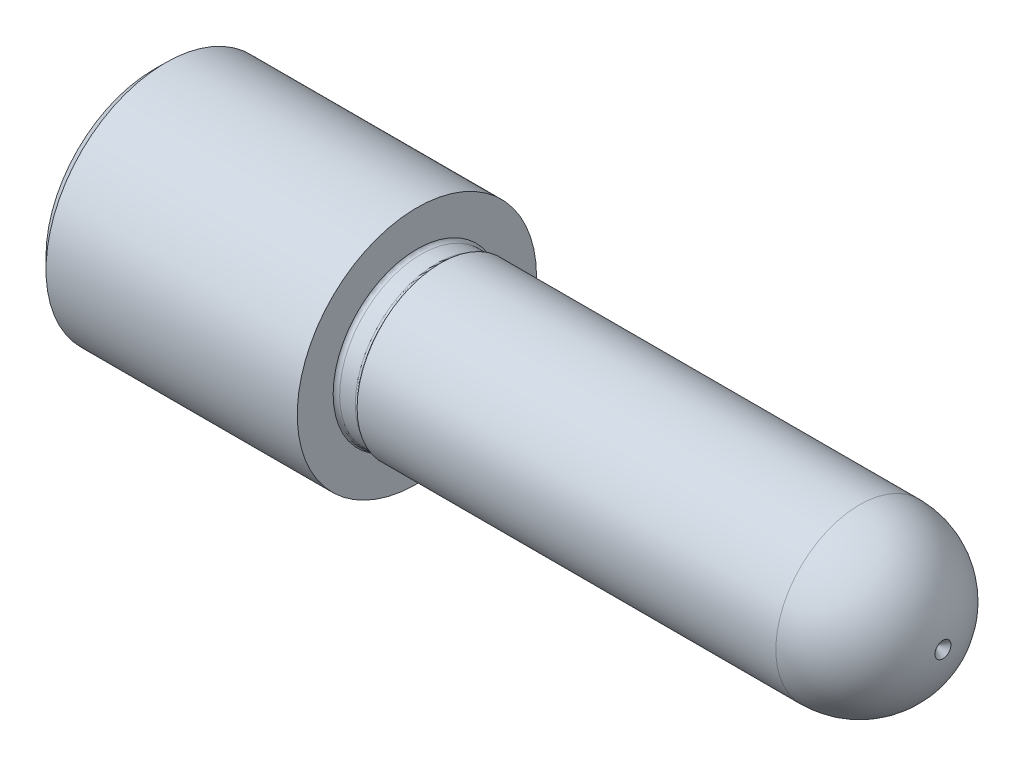
ISO-10303-21;
HEADER;
FILE_DESCRIPTION(('STEP AP214'),'2;1');
FILE_NAME('part.step','',(''),(''),'','','');
FILE_SCHEMA(('AUTOMOTIVE_DESIGN { 1 0 10303 214 1 1 1 1 }'));
ENDSEC;
DATA;
#1=APPLICATION_CONTEXT('core data for automotive mechanical design processes');
#2=APPLICATION_PROTOCOL_DEFINITION('international standard','automotive_design',2000,#1);
#3=PRODUCT_CONTEXT('',#1,'mechanical');
#4=PRODUCT('Part','Part','',(#3));
#5=PRODUCT_RELATED_PRODUCT_CATEGORY('part','',(#4));
#6=PRODUCT_DEFINITION_FORMATION('','',#4);
#7=PRODUCT_DEFINITION_CONTEXT('part definition',#1,'design');
#8=PRODUCT_DEFINITION('design','',#6,#7);
#9=PRODUCT_DEFINITION_SHAPE('','',#8);
#10=(LENGTH_UNIT() NAMED_UNIT(*) SI_UNIT(.MILLI.,.METRE.));
#11=(NAMED_UNIT(*) PLANE_ANGLE_UNIT() SI_UNIT($,.RADIAN.));
#12=(NAMED_UNIT(*) SI_UNIT($,.STERADIAN.) SOLID_ANGLE_UNIT());
#13=UNCERTAINTY_MEASURE_WITH_UNIT(LENGTH_MEASURE(1.E-05),#10,'distance_accuracy_value','');
#14=(GEOMETRIC_REPRESENTATION_CONTEXT(3) GLOBAL_UNCERTAINTY_ASSIGNED_CONTEXT((#13)) GLOBAL_UNIT_ASSIGNED_CONTEXT((#10,
#11,#12)) REPRESENTATION_CONTEXT('',''));
#15=CARTESIAN_POINT('',(0.,0.,0.));
#16=DIRECTION('',(0.,0.,1.));
#17=DIRECTION('',(1.,0.,0.));
#18=AXIS2_PLACEMENT_3D('',#15,#16,#17);
#19=CARTESIAN_POINT('',(2.25869692121705,0.,0.));
#20=DIRECTION('',(-1.,0.,0.));
#21=DIRECTION('',(0.,0.,1.));
#22=AXIS2_PLACEMENT_3D('',#19,#20,#21);
#23=CONICAL_SURFACE('',#22,2.15000000002874,1.04719755120262);
#24=CARTESIAN_POINT('',(3.5000000000025,2.8421709430404E-11,0.));
#25=VERTEX_POINT('',#24);
#26=VERTEX_LOOP('',#25);
#27=FACE_BOUND('',#26,.T.);
#28=CARTESIAN_POINT('',(2.2586969212423,0.,0.));
#29=DIRECTION('',(1.,0.,0.));
#30=DIRECTION('',(0.,0.,-1.));
#31=AXIS2_PLACEMENT_3D('',#28,#29,#30);
#32=CIRCLE('',#31,2.15);
#33=CARTESIAN_POINT('',(2.2586969212423,0.,-2.15));
#34=VERTEX_POINT('',#33);
#35=EDGE_CURVE('E37',#34,#34,#32,.F.);
#36=ORIENTED_EDGE('',*,*,#35,.T.);
#37=EDGE_LOOP('',(#36));
#38=FACE_BOUND('',#37,.T.);
#39=ADVANCED_FACE('F17',(#27,#38),#23,.F.);
#40=CARTESIAN_POINT('',(-4.37065153937885,0.,0.));
#41=DIRECTION('',(1.,0.,0.));
#42=DIRECTION('',(0.,0.,-1.));
#43=AXIS2_PLACEMENT_3D('',#40,#41,#42);
#44=CYLINDRICAL_SURFACE('',#43,2.15);
#45=CARTESIAN_POINT('',(-10.6500000000551,0.,0.));
#46=DIRECTION('',(-1.,0.,0.));
#47=DIRECTION('',(0.,1.,0.));
#48=AXIS2_PLACEMENT_3D('',#45,#46,#47);
#49=CIRCLE('',#48,2.1499999999719);
#50=CARTESIAN_POINT('',(-10.6500000000551,2.1499999999719,0.));
#51=VERTEX_POINT('',#50);
#52=EDGE_CURVE('E39',#51,#51,#49,.T.);
#53=ORIENTED_EDGE('',*,*,#52,.T.);
#54=EDGE_LOOP('',(#53));
#55=FACE_BOUND('',#54,.T.);
#56=ORIENTED_EDGE('',*,*,#35,.F.);
#57=EDGE_LOOP('',(#56));
#58=FACE_BOUND('',#57,.T.);
#59=ADVANCED_FACE('F34',(#55,#58),#44,.F.);
#60=CARTESIAN_POINT('',(-11.0000000000241,0.,0.));
#61=DIRECTION('',(-1.,0.,0.));
#62=DIRECTION('',(0.,0.,1.));
#63=AXIS2_PLACEMENT_3D('',#60,#61,#62);
#64=CONICAL_SURFACE('',#63,2.49999999999773,0.785398163478653);
#65=CARTESIAN_POINT('',(-11.0000000000241,0.,0.));
#66=DIRECTION('',(-1.,0.,0.));
#67=DIRECTION('',(0.,0.,1.));
#68=AXIS2_PLACEMENT_3D('',#65,#66,#67);
#69=CIRCLE('',#68,2.49999999999773);
#70=CARTESIAN_POINT('',(-11.0000000000241,0.,2.49999999999773));
#71=VERTEX_POINT('',#70);
#72=EDGE_CURVE('E20',#71,#71,#69,.F.);
#73=ORIENTED_EDGE('',*,*,#72,.F.);
#74=EDGE_LOOP('',(#73));
#75=FACE_BOUND('',#74,.T.);
#76=ORIENTED_EDGE('',*,*,#52,.F.);
#77=EDGE_LOOP('',(#76));
#78=FACE_BOUND('',#77,.T.);
#79=ADVANCED_FACE('F62',(#75,#78),#64,.F.);
#80=CARTESIAN_POINT('',(-11.,2.5,0.));
#81=DIRECTION('',(-1.,0.,0.));
#82=DIRECTION('',(0.,0.,1.));
#83=AXIS2_PLACEMENT_3D('',#80,#81,#82);
#84=PLANE('',#83);
#85=CARTESIAN_POINT('',(-10.9999999999673,0.,0.));
#86=DIRECTION('',(1.,0.,0.));
#87=DIRECTION('',(0.,0.,-1.));
#88=AXIS2_PLACEMENT_3D('',#85,#86,#87);
#89=CIRCLE('',#88,4.50000000000728);
#90=CARTESIAN_POINT('',(-10.9999999999673,0.,-4.50000000000728));
#91=VERTEX_POINT('',#90);
#92=EDGE_CURVE('E52',#91,#91,#89,.T.);
#93=ORIENTED_EDGE('',*,*,#92,.F.);
#94=EDGE_LOOP('',(#93));
#95=FACE_BOUND('',#94,.T.);
#96=ORIENTED_EDGE('',*,*,#72,.T.);
#97=EDGE_LOOP('',(#96));
#98=FACE_BOUND('',#97,.T.);
#99=ADVANCED_FACE('F60',(#95,#98),#84,.T.);
#100=CARTESIAN_POINT('',(-10.5000000000928,0.,0.));
#101=DIRECTION('',(1.,0.,0.));
#102=DIRECTION('',(0.,0.,-1.));
#103=AXIS2_PLACEMENT_3D('',#100,#101,#102);
#104=CONICAL_SURFACE('',#103,4.99999999993861,0.785398163454292);
#105=ORIENTED_EDGE('',*,*,#92,.T.);
#106=EDGE_LOOP('',(#105));
#107=FACE_BOUND('',#106,.T.);
#108=CARTESIAN_POINT('',(-10.5,0.,0.));
#109=DIRECTION('',(1.,0.,0.));
#110=DIRECTION('',(0.,0.,-1.));
#111=AXIS2_PLACEMENT_3D('',#108,#109,#110);
#112=CIRCLE('',#111,5.);
#113=CARTESIAN_POINT('',(-10.5,0.,-5.));
#114=VERTEX_POINT('',#113);
#115=EDGE_CURVE('E51',#114,#114,#112,.T.);
#116=ORIENTED_EDGE('',*,*,#115,.F.);
#117=EDGE_LOOP('',(#116));
#118=FACE_BOUND('',#117,.T.);
#119=ADVANCED_FACE('F116',(#107,#118),#104,.T.);
#120=CARTESIAN_POINT('',(-5.25,0.,0.));
#121=DIRECTION('',(1.,0.,0.));
#122=DIRECTION('',(0.,0.,-1.));
#123=AXIS2_PLACEMENT_3D('',#120,#121,#122);
#124=CYLINDRICAL_SURFACE('',#123,5.);
#125=ORIENTED_EDGE('',*,*,#115,.T.);
#126=EDGE_LOOP('',(#125));
#127=FACE_BOUND('',#126,.T.);
#128=CARTESIAN_POINT('',(0.,0.,0.));
#129=DIRECTION('',(1.,0.,0.));
#130=DIRECTION('',(0.,0.,-1.));
#131=AXIS2_PLACEMENT_3D('',#128,#129,#130);
#132=CIRCLE('',#131,5.);
#133=CARTESIAN_POINT('',(0.,0.,-5.));
#134=VERTEX_POINT('',#133);
#135=EDGE_CURVE('E49',#134,#134,#132,.T.);
#136=ORIENTED_EDGE('',*,*,#135,.F.);
#137=EDGE_LOOP('',(#136));
#138=FACE_BOUND('',#137,.T.);
#139=ADVANCED_FACE('F112',(#127,#138),#124,.T.);
#140=CARTESIAN_POINT('',(0.,2.5,0.));
#141=DIRECTION('',(1.,0.,0.));
#142=DIRECTION('',(0.,0.,-1.));
#143=AXIS2_PLACEMENT_3D('',#140,#141,#142);
#144=PLANE('',#143);
#145=ORIENTED_EDGE('',*,*,#135,.T.);
#146=EDGE_LOOP('',(#145));
#147=FACE_BOUND('',#146,.T.);
#148=CARTESIAN_POINT('',(0.,0.,0.));
#149=DIRECTION('',(-1.,0.,0.));
#150=DIRECTION('',(0.,0.,1.));
#151=AXIS2_PLACEMENT_3D('',#148,#149,#150);
#152=CIRCLE('',#151,3.5);
#153=CARTESIAN_POINT('',(0.,0.,3.5));
#154=VERTEX_POINT('',#153);
#155=EDGE_CURVE('E45',#154,#154,#152,.T.);
#156=ORIENTED_EDGE('',*,*,#155,.T.);
#157=EDGE_LOOP('',(#156));
#158=FACE_BOUND('',#157,.T.);
#159=ADVANCED_FACE('F108',(#147,#158),#144,.T.);
#160=CARTESIAN_POINT('',(0.173205080756889,0.,0.));
#161=DIRECTION('',(-1.,0.,0.));
#162=DIRECTION('',(0.,0.,1.));
#163=AXIS2_PLACEMENT_3D('',#160,#161,#162);
#164=TOROIDAL_SURFACE('',#163,3.6,0.200000000000001);
#165=CARTESIAN_POINT('',(0.173205080756888,0.,0.));
#166=DIRECTION('',(1.,0.,0.));
#167=DIRECTION('',(0.,0.,-1.));
#168=AXIS2_PLACEMENT_3D('',#165,#166,#167);
#169=CIRCLE('',#168,3.4);
#170=CARTESIAN_POINT('',(0.173205080756888,0.,-3.4));
#171=VERTEX_POINT('',#170);
#172=EDGE_CURVE('E48',#171,#171,#169,.T.);
#173=ORIENTED_EDGE('',*,*,#172,.F.);
#174=EDGE_LOOP('',(#173));
#175=FACE_BOUND('',#174,.T.);
#176=ORIENTED_EDGE('',*,*,#155,.F.);
#177=EDGE_LOOP('',(#176));
#178=FACE_BOUND('',#177,.T.);
#179=ADVANCED_FACE('F103',(#175,#178),#164,.F.);
#180=CARTESIAN_POINT('',(21.9840246199965,0.,0.));
#181=DIRECTION('',(1.,0.,0.));
#182=DIRECTION('',(0.,0.,-1.));
#183=AXIS2_PLACEMENT_3D('',#180,#181,#182);
#184=CONICAL_SURFACE('',#183,0.334024620144646,0.785398163057094);
#185=CARTESIAN_POINT('',(21.6499999998803,-5.6843418860808E-11,0.));
#186=VERTEX_POINT('',#185);
#187=VERTEX_LOOP('',#186);
#188=FACE_BOUND('',#187,.T.);
#189=CARTESIAN_POINT('',(21.9840246200613,0.,0.));
#190=DIRECTION('',(1.,0.,0.));
#191=DIRECTION('',(0.,1.,0.));
#192=AXIS2_PLACEMENT_3D('',#189,#190,#191);
#193=CIRCLE('',#192,0.334024620061248);
#194=CARTESIAN_POINT('',(21.9840246200613,0.334024620061248,0.));
#195=VERTEX_POINT('',#194);
#196=EDGE_CURVE('E94',#195,#195,#193,.F.);
#197=ORIENTED_EDGE('',*,*,#196,.F.);
#198=EDGE_LOOP('',(#197));
#199=FACE_BOUND('',#198,.T.);
#200=ADVANCED_FACE('F107',(#188,#199),#184,.F.);
#201=CARTESIAN_POINT('',(0.5,0.,0.));
#202=DIRECTION('',(1.,0.,0.));
#203=DIRECTION('',(0.,0.,-1.));
#204=AXIS2_PLACEMENT_3D('',#201,#202,#203);
#205=CYLINDRICAL_SURFACE('',#204,3.4);
#206=CARTESIAN_POINT('',(0.826794919243112,0.,0.));
#207=DIRECTION('',(-1.,0.,0.));
#208=DIRECTION('',(0.,0.,1.));
#209=AXIS2_PLACEMENT_3D('',#206,#207,#208);
#210=CIRCLE('',#209,3.4);
#211=CARTESIAN_POINT('',(0.826794919243112,0.,3.4));
#212=VERTEX_POINT('',#211);
#213=EDGE_CURVE('E92',#212,#212,#210,.T.);
#214=ORIENTED_EDGE('',*,*,#213,.T.);
#215=EDGE_LOOP('',(#214));
#216=FACE_BOUND('',#215,.T.);
#217=ORIENTED_EDGE('',*,*,#172,.T.);
#218=EDGE_LOOP('',(#217));
#219=FACE_BOUND('',#218,.T.);
#220=ADVANCED_FACE('F150',(#216,#219),#205,.T.);
#221=CARTESIAN_POINT('',(18.5,0.,0.));
#222=DIRECTION('',(1.,0.,0.));
#223=DIRECTION('',(0.,1.,0.));
#224=AXIS2_PLACEMENT_3D('',#221,#222,#223);
#225=SPHERICAL_SURFACE('',#224,3.5);
#226=ORIENTED_EDGE('',*,*,#196,.T.);
#227=EDGE_LOOP('',(#226));
#228=FACE_BOUND('',#227,.T.);
#229=CARTESIAN_POINT('',(18.5,0.,0.));
#230=DIRECTION('',(1.,0.,0.));
#231=DIRECTION('',(0.,0.,-1.));
#232=AXIS2_PLACEMENT_3D('',#229,#230,#231);
#233=CIRCLE('',#232,3.5);
#234=CARTESIAN_POINT('',(18.5,0.,-3.5));
#235=VERTEX_POINT('',#234);
#236=EDGE_CURVE('E26',#235,#235,#233,.F.);
#237=ORIENTED_EDGE('',*,*,#236,.F.);
#238=EDGE_LOOP('',(#237));
#239=FACE_BOUND('',#238,.T.);
#240=ADVANCED_FACE('F80',(#228,#239),#225,.T.);
#241=CARTESIAN_POINT('',(0.826794919243112,0.,0.));
#242=DIRECTION('',(-1.,0.,0.));
#243=DIRECTION('',(0.,0.,1.));
#244=AXIS2_PLACEMENT_3D('',#241,#242,#243);
#245=TOROIDAL_SURFACE('',#244,3.6,0.200000000000001);
#246=CARTESIAN_POINT('',(0.999999999999999,0.,0.));
#247=DIRECTION('',(1.,0.,0.));
#248=DIRECTION('',(0.,0.,-1.));
#249=AXIS2_PLACEMENT_3D('',#246,#247,#248);
#250=CIRCLE('',#249,3.5);
#251=CARTESIAN_POINT('',(0.999999999999999,0.,-3.5));
#252=VERTEX_POINT('',#251);
#253=EDGE_CURVE('E11',#252,#252,#250,.T.);
#254=ORIENTED_EDGE('',*,*,#253,.F.);
#255=EDGE_LOOP('',(#254));
#256=FACE_BOUND('',#255,.T.);
#257=ORIENTED_EDGE('',*,*,#213,.F.);
#258=EDGE_LOOP('',(#257));
#259=FACE_BOUND('',#258,.T.);
#260=ADVANCED_FACE('F74',(#256,#259),#245,.F.);
#261=CARTESIAN_POINT('',(9.25,0.,0.));
#262=DIRECTION('',(1.,0.,0.));
#263=DIRECTION('',(0.,0.,-1.));
#264=AXIS2_PLACEMENT_3D('',#261,#262,#263);
#265=CYLINDRICAL_SURFACE('',#264,3.5);
#266=ORIENTED_EDGE('',*,*,#236,.T.);
#267=EDGE_LOOP('',(#266));
#268=FACE_BOUND('',#267,.T.);
#269=ORIENTED_EDGE('',*,*,#253,.T.);
#270=EDGE_LOOP('',(#269));
#271=FACE_BOUND('',#270,.T.);
#272=ADVANCED_FACE('F72',(#268,#271),#265,.T.);
#273=CLOSED_SHELL('',(#39,#59,#79,#99,#119,#139,#159,#179,#200,#220,#240,#260,#272));
#274=MANIFOLD_SOLID_BREP('B1',#273);
#275=ADVANCED_BREP_SHAPE_REPRESENTATION('',(#18,#274),#14);
#276=SHAPE_DEFINITION_REPRESENTATION(#9,#275);
ENDSEC;
END-ISO-10303-21;
